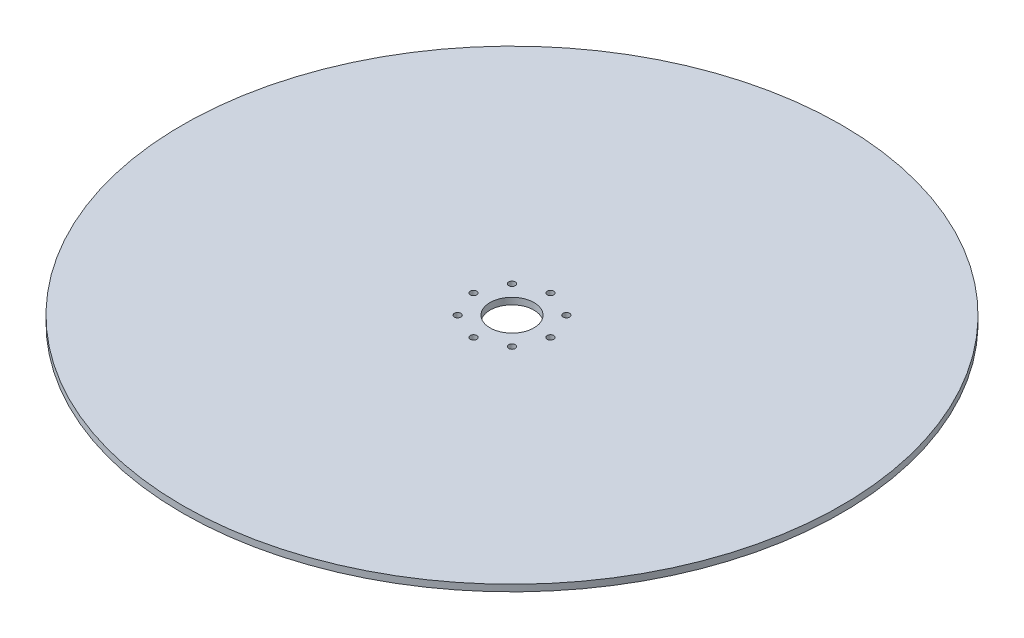
ISO-10303-21;
HEADER;
FILE_DESCRIPTION(('STEP AP214'),'2;1');
FILE_NAME('part.step','',(''),(''),'','','');
FILE_SCHEMA(('AUTOMOTIVE_DESIGN { 1 0 10303 214 1 1 1 1 }'));
ENDSEC;
DATA;
#1=APPLICATION_CONTEXT('core data for automotive mechanical design processes');
#2=APPLICATION_PROTOCOL_DEFINITION('international standard','automotive_design',2000,#1);
#3=PRODUCT_CONTEXT('',#1,'mechanical');
#4=PRODUCT('Part','Part','',(#3));
#5=PRODUCT_RELATED_PRODUCT_CATEGORY('part','',(#4));
#6=PRODUCT_DEFINITION_FORMATION('','',#4);
#7=PRODUCT_DEFINITION_CONTEXT('part definition',#1,'design');
#8=PRODUCT_DEFINITION('design','',#6,#7);
#9=PRODUCT_DEFINITION_SHAPE('','',#8);
#10=(LENGTH_UNIT() NAMED_UNIT(*) SI_UNIT(.MILLI.,.METRE.));
#11=(NAMED_UNIT(*) PLANE_ANGLE_UNIT() SI_UNIT($,.RADIAN.));
#12=(NAMED_UNIT(*) SI_UNIT($,.STERADIAN.) SOLID_ANGLE_UNIT());
#13=UNCERTAINTY_MEASURE_WITH_UNIT(LENGTH_MEASURE(1.E-05),#10,'distance_accuracy_value','');
#14=(GEOMETRIC_REPRESENTATION_CONTEXT(3) GLOBAL_UNCERTAINTY_ASSIGNED_CONTEXT((#13)) GLOBAL_UNIT_ASSIGNED_CONTEXT((#10,
#11,#12)) REPRESENTATION_CONTEXT('',''));
#15=CARTESIAN_POINT('',(0.,0.,0.));
#16=DIRECTION('',(0.,0.,1.));
#17=DIRECTION('',(1.,0.,0.));
#18=AXIS2_PLACEMENT_3D('',#15,#16,#17);
#19=CARTESIAN_POINT('',(0.,3.,0.));
#20=DIRECTION('',(0.,1.,0.));
#21=DIRECTION('',(0.,0.,1.));
#22=AXIS2_PLACEMENT_3D('',#19,#20,#21);
#23=PLANE('',#22);
#24=CARTESIAN_POINT('',(-12.3743686707646,3.,12.3743686707646));
#25=DIRECTION('',(0.,1.,0.));
#26=DIRECTION('',(0.,0.,1.));
#27=AXIS2_PLACEMENT_3D('',#24,#25,#26);
#28=CIRCLE('',#27,1.5);
#29=CARTESIAN_POINT('',(-12.3743686707646,3.,13.8743686707646));
#30=VERTEX_POINT('',#29);
#31=EDGE_CURVE('E90',#30,#30,#28,.T.);
#32=ORIENTED_EDGE('',*,*,#31,.F.);
#33=EDGE_LOOP('',(#32));
#34=FACE_BOUND('',#33,.T.);
#35=CARTESIAN_POINT('',(12.3743686707646,3.,12.3743686707646));
#36=DIRECTION('',(0.,1.,0.));
#37=DIRECTION('',(0.,0.,-1.));
#38=AXIS2_PLACEMENT_3D('',#35,#36,#37);
#39=CIRCLE('',#38,1.5);
#40=CARTESIAN_POINT('',(12.3743686707646,3.,10.8743686707646));
#41=VERTEX_POINT('',#40);
#42=EDGE_CURVE('E78',#41,#41,#39,.T.);
#43=ORIENTED_EDGE('',*,*,#42,.F.);
#44=EDGE_LOOP('',(#43));
#45=FACE_BOUND('',#44,.T.);
#46=CARTESIAN_POINT('',(0.,3.,-17.5));
#47=DIRECTION('',(0.,1.,0.));
#48=DIRECTION('',(0.,0.,1.));
#49=AXIS2_PLACEMENT_3D('',#46,#47,#48);
#50=CIRCLE('',#49,1.5);
#51=CARTESIAN_POINT('',(0.,3.,-16.));
#52=VERTEX_POINT('',#51);
#53=EDGE_CURVE('E66',#52,#52,#50,.T.);
#54=ORIENTED_EDGE('',*,*,#53,.F.);
#55=EDGE_LOOP('',(#54));
#56=FACE_BOUND('',#55,.T.);
#57=CARTESIAN_POINT('',(12.3743686707646,3.,-12.3743686707646));
#58=DIRECTION('',(0.,1.,0.));
#59=DIRECTION('',(0.,0.,1.));
#60=AXIS2_PLACEMENT_3D('',#57,#58,#59);
#61=CIRCLE('',#60,1.5);
#62=CARTESIAN_POINT('',(12.3743686707646,3.,-10.8743686707646));
#63=VERTEX_POINT('',#62);
#64=EDGE_CURVE('E54',#63,#63,#61,.T.);
#65=ORIENTED_EDGE('',*,*,#64,.F.);
#66=EDGE_LOOP('',(#65));
#67=FACE_BOUND('',#66,.T.);
#68=CARTESIAN_POINT('',(0.,3.,0.));
#69=DIRECTION('',(0.,1.,0.));
#70=DIRECTION('',(0.,0.,1.));
#71=AXIS2_PLACEMENT_3D('',#68,#69,#70);
#72=CIRCLE('',#71,150.);
#73=CARTESIAN_POINT('',(0.,3.,150.));
#74=VERTEX_POINT('',#73);
#75=EDGE_CURVE('E10',#74,#74,#72,.T.);
#76=ORIENTED_EDGE('',*,*,#75,.T.);
#77=EDGE_LOOP('',(#76));
#78=FACE_BOUND('',#77,.T.);
#79=CARTESIAN_POINT('',(0.,3.,0.));
#80=DIRECTION('',(0.,1.,0.));
#81=DIRECTION('',(0.,0.,1.));
#82=AXIS2_PLACEMENT_3D('',#79,#80,#81);
#83=CIRCLE('',#82,10.);
#84=CARTESIAN_POINT('',(0.,3.,10.));
#85=VERTEX_POINT('',#84);
#86=EDGE_CURVE('E49',#85,#85,#83,.T.);
#87=ORIENTED_EDGE('',*,*,#86,.F.);
#88=EDGE_LOOP('',(#87));
#89=FACE_BOUND('',#88,.T.);
#90=CARTESIAN_POINT('',(-12.3743686707646,3.,-12.3743686707646));
#91=DIRECTION('',(0.,1.,0.));
#92=DIRECTION('',(0.,0.,-1.));
#93=AXIS2_PLACEMENT_3D('',#90,#91,#92);
#94=CIRCLE('',#93,1.5);
#95=CARTESIAN_POINT('',(-12.3743686707646,3.,-13.8743686707646));
#96=VERTEX_POINT('',#95);
#97=EDGE_CURVE('E60',#96,#96,#94,.T.);
#98=ORIENTED_EDGE('',*,*,#97,.F.);
#99=EDGE_LOOP('',(#98));
#100=FACE_BOUND('',#99,.T.);
#101=CARTESIAN_POINT('',(17.5,3.,0.));
#102=DIRECTION('',(0.,1.,0.));
#103=DIRECTION('',(0.,0.,1.));
#104=AXIS2_PLACEMENT_3D('',#101,#102,#103);
#105=CIRCLE('',#104,1.5);
#106=CARTESIAN_POINT('',(17.5,3.,1.5));
#107=VERTEX_POINT('',#106);
#108=EDGE_CURVE('E72',#107,#107,#105,.T.);
#109=ORIENTED_EDGE('',*,*,#108,.F.);
#110=EDGE_LOOP('',(#109));
#111=FACE_BOUND('',#110,.T.);
#112=CARTESIAN_POINT('',(0.,3.,17.5));
#113=DIRECTION('',(0.,1.,0.));
#114=DIRECTION('',(0.,0.,-1.));
#115=AXIS2_PLACEMENT_3D('',#112,#113,#114);
#116=CIRCLE('',#115,1.5);
#117=CARTESIAN_POINT('',(0.,3.,16.));
#118=VERTEX_POINT('',#117);
#119=EDGE_CURVE('E84',#118,#118,#116,.T.);
#120=ORIENTED_EDGE('',*,*,#119,.F.);
#121=EDGE_LOOP('',(#120));
#122=FACE_BOUND('',#121,.T.);
#123=CARTESIAN_POINT('',(-17.5,3.,0.));
#124=DIRECTION('',(0.,1.,0.));
#125=DIRECTION('',(0.,0.,-1.));
#126=AXIS2_PLACEMENT_3D('',#123,#124,#125);
#127=CIRCLE('',#126,1.5);
#128=CARTESIAN_POINT('',(-17.5,3.,-1.5));
#129=VERTEX_POINT('',#128);
#130=EDGE_CURVE('E96',#129,#129,#127,.T.);
#131=ORIENTED_EDGE('',*,*,#130,.F.);
#132=EDGE_LOOP('',(#131));
#133=FACE_BOUND('',#132,.T.);
#134=ADVANCED_FACE('F38',(#34,#45,#56,#67,#78,#89,#100,#111,#122,#133),#23,.T.);
#135=CARTESIAN_POINT('',(0.,0.,0.));
#136=DIRECTION('',(0.,1.,0.));
#137=DIRECTION('',(0.,0.,1.));
#138=AXIS2_PLACEMENT_3D('',#135,#136,#137);
#139=PLANE('',#138);
#140=CARTESIAN_POINT('',(0.,0.,0.));
#141=DIRECTION('',(0.,1.,0.));
#142=DIRECTION('',(0.,0.,1.));
#143=AXIS2_PLACEMENT_3D('',#140,#141,#142);
#144=CIRCLE('',#143,150.);
#145=CARTESIAN_POINT('',(0.,0.,150.));
#146=VERTEX_POINT('',#145);
#147=EDGE_CURVE('E42',#146,#146,#144,.T.);
#148=ORIENTED_EDGE('',*,*,#147,.F.);
#149=EDGE_LOOP('',(#148));
#150=FACE_BOUND('',#149,.T.);
#151=CARTESIAN_POINT('',(0.,0.,0.));
#152=DIRECTION('',(0.,1.,0.));
#153=DIRECTION('',(0.,0.,1.));
#154=AXIS2_PLACEMENT_3D('',#151,#152,#153);
#155=CIRCLE('',#154,10.);
#156=CARTESIAN_POINT('',(0.,0.,10.));
#157=VERTEX_POINT('',#156);
#158=EDGE_CURVE('E51',#157,#157,#155,.T.);
#159=ORIENTED_EDGE('',*,*,#158,.T.);
#160=EDGE_LOOP('',(#159));
#161=FACE_BOUND('',#160,.T.);
#162=CARTESIAN_POINT('',(12.3743686707646,0.,-12.3743686707646));
#163=DIRECTION('',(0.,1.,0.));
#164=DIRECTION('',(0.,0.,1.));
#165=AXIS2_PLACEMENT_3D('',#162,#163,#164);
#166=CIRCLE('',#165,1.5);
#167=CARTESIAN_POINT('',(12.3743686707646,0.,-10.8743686707646));
#168=VERTEX_POINT('',#167);
#169=EDGE_CURVE('E57',#168,#168,#166,.T.);
#170=ORIENTED_EDGE('',*,*,#169,.T.);
#171=EDGE_LOOP('',(#170));
#172=FACE_BOUND('',#171,.T.);
#173=CARTESIAN_POINT('',(-12.3743686707646,0.,-12.3743686707646));
#174=DIRECTION('',(0.,1.,0.));
#175=DIRECTION('',(0.,0.,-1.));
#176=AXIS2_PLACEMENT_3D('',#173,#174,#175);
#177=CIRCLE('',#176,1.5);
#178=CARTESIAN_POINT('',(-12.3743686707646,0.,-13.8743686707646));
#179=VERTEX_POINT('',#178);
#180=EDGE_CURVE('E63',#179,#179,#177,.T.);
#181=ORIENTED_EDGE('',*,*,#180,.T.);
#182=EDGE_LOOP('',(#181));
#183=FACE_BOUND('',#182,.T.);
#184=CARTESIAN_POINT('',(0.,0.,-17.5));
#185=DIRECTION('',(0.,1.,0.));
#186=DIRECTION('',(0.,0.,1.));
#187=AXIS2_PLACEMENT_3D('',#184,#185,#186);
#188=CIRCLE('',#187,1.5);
#189=CARTESIAN_POINT('',(0.,0.,-16.));
#190=VERTEX_POINT('',#189);
#191=EDGE_CURVE('E69',#190,#190,#188,.T.);
#192=ORIENTED_EDGE('',*,*,#191,.T.);
#193=EDGE_LOOP('',(#192));
#194=FACE_BOUND('',#193,.T.);
#195=CARTESIAN_POINT('',(17.5,0.,0.));
#196=DIRECTION('',(0.,1.,0.));
#197=DIRECTION('',(0.,0.,1.));
#198=AXIS2_PLACEMENT_3D('',#195,#196,#197);
#199=CIRCLE('',#198,1.5);
#200=CARTESIAN_POINT('',(17.5,0.,1.5));
#201=VERTEX_POINT('',#200);
#202=EDGE_CURVE('E75',#201,#201,#199,.T.);
#203=ORIENTED_EDGE('',*,*,#202,.T.);
#204=EDGE_LOOP('',(#203));
#205=FACE_BOUND('',#204,.T.);
#206=CARTESIAN_POINT('',(12.3743686707646,0.,12.3743686707646));
#207=DIRECTION('',(0.,1.,0.));
#208=DIRECTION('',(0.,0.,-1.));
#209=AXIS2_PLACEMENT_3D('',#206,#207,#208);
#210=CIRCLE('',#209,1.5);
#211=CARTESIAN_POINT('',(12.3743686707646,0.,10.8743686707646));
#212=VERTEX_POINT('',#211);
#213=EDGE_CURVE('E81',#212,#212,#210,.T.);
#214=ORIENTED_EDGE('',*,*,#213,.T.);
#215=EDGE_LOOP('',(#214));
#216=FACE_BOUND('',#215,.T.);
#217=CARTESIAN_POINT('',(0.,0.,17.5));
#218=DIRECTION('',(0.,1.,0.));
#219=DIRECTION('',(0.,0.,-1.));
#220=AXIS2_PLACEMENT_3D('',#217,#218,#219);
#221=CIRCLE('',#220,1.5);
#222=CARTESIAN_POINT('',(0.,0.,16.));
#223=VERTEX_POINT('',#222);
#224=EDGE_CURVE('E87',#223,#223,#221,.T.);
#225=ORIENTED_EDGE('',*,*,#224,.T.);
#226=EDGE_LOOP('',(#225));
#227=FACE_BOUND('',#226,.T.);
#228=CARTESIAN_POINT('',(-12.3743686707646,0.,12.3743686707646));
#229=DIRECTION('',(0.,1.,0.));
#230=DIRECTION('',(0.,0.,1.));
#231=AXIS2_PLACEMENT_3D('',#228,#229,#230);
#232=CIRCLE('',#231,1.5);
#233=CARTESIAN_POINT('',(-12.3743686707646,0.,13.8743686707646));
#234=VERTEX_POINT('',#233);
#235=EDGE_CURVE('E93',#234,#234,#232,.T.);
#236=ORIENTED_EDGE('',*,*,#235,.T.);
#237=EDGE_LOOP('',(#236));
#238=FACE_BOUND('',#237,.T.);
#239=CARTESIAN_POINT('',(-17.5,0.,0.));
#240=DIRECTION('',(0.,1.,0.));
#241=DIRECTION('',(0.,0.,-1.));
#242=AXIS2_PLACEMENT_3D('',#239,#240,#241);
#243=CIRCLE('',#242,1.5);
#244=CARTESIAN_POINT('',(-17.5,0.,-1.5));
#245=VERTEX_POINT('',#244);
#246=EDGE_CURVE('E99',#245,#245,#243,.T.);
#247=ORIENTED_EDGE('',*,*,#246,.T.);
#248=EDGE_LOOP('',(#247));
#249=FACE_BOUND('',#248,.T.);
#250=ADVANCED_FACE('F109',(#150,#161,#172,#183,#194,#205,#216,#227,#238,#249),#139,.F.);
#251=CARTESIAN_POINT('',(0.,3.,0.));
#252=DIRECTION('',(0.,-1.,0.));
#253=DIRECTION('',(0.,0.,-1.));
#254=AXIS2_PLACEMENT_3D('',#251,#252,#253);
#255=CYLINDRICAL_SURFACE('',#254,150.);
#256=ORIENTED_EDGE('',*,*,#75,.F.);
#257=EDGE_LOOP('',(#256));
#258=FACE_BOUND('',#257,.T.);
#259=ORIENTED_EDGE('',*,*,#147,.T.);
#260=EDGE_LOOP('',(#259));
#261=FACE_BOUND('',#260,.T.);
#262=ADVANCED_FACE('F40',(#258,#261),#255,.T.);
#263=CARTESIAN_POINT('',(0.,3.,0.));
#264=DIRECTION('',(0.,-1.,0.));
#265=DIRECTION('',(0.,0.,-1.));
#266=AXIS2_PLACEMENT_3D('',#263,#264,#265);
#267=CYLINDRICAL_SURFACE('',#266,10.);
#268=ORIENTED_EDGE('',*,*,#86,.T.);
#269=EDGE_LOOP('',(#268));
#270=FACE_BOUND('',#269,.T.);
#271=ORIENTED_EDGE('',*,*,#158,.F.);
#272=EDGE_LOOP('',(#271));
#273=FACE_BOUND('',#272,.T.);
#274=ADVANCED_FACE('F119',(#270,#273),#267,.F.);
#275=CARTESIAN_POINT('',(12.3743686707646,3.,-12.3743686707646));
#276=DIRECTION('',(0.,-1.,0.));
#277=DIRECTION('',(0.,0.,-1.));
#278=AXIS2_PLACEMENT_3D('',#275,#276,#277);
#279=CYLINDRICAL_SURFACE('',#278,1.5);
#280=ORIENTED_EDGE('',*,*,#64,.T.);
#281=EDGE_LOOP('',(#280));
#282=FACE_BOUND('',#281,.T.);
#283=ORIENTED_EDGE('',*,*,#169,.F.);
#284=EDGE_LOOP('',(#283));
#285=FACE_BOUND('',#284,.T.);
#286=ADVANCED_FACE('F122',(#282,#285),#279,.F.);
#287=CARTESIAN_POINT('',(-12.3743686707646,3.,-12.3743686707646));
#288=DIRECTION('',(0.,-1.,0.));
#289=DIRECTION('',(0.,0.,-1.));
#290=AXIS2_PLACEMENT_3D('',#287,#288,#289);
#291=CYLINDRICAL_SURFACE('',#290,1.5);
#292=ORIENTED_EDGE('',*,*,#97,.T.);
#293=EDGE_LOOP('',(#292));
#294=FACE_BOUND('',#293,.T.);
#295=ORIENTED_EDGE('',*,*,#180,.F.);
#296=EDGE_LOOP('',(#295));
#297=FACE_BOUND('',#296,.T.);
#298=ADVANCED_FACE('F126',(#294,#297),#291,.F.);
#299=CARTESIAN_POINT('',(0.,3.,-17.5));
#300=DIRECTION('',(0.,-1.,0.));
#301=DIRECTION('',(0.,0.,-1.));
#302=AXIS2_PLACEMENT_3D('',#299,#300,#301);
#303=CYLINDRICAL_SURFACE('',#302,1.5);
#304=ORIENTED_EDGE('',*,*,#53,.T.);
#305=EDGE_LOOP('',(#304));
#306=FACE_BOUND('',#305,.T.);
#307=ORIENTED_EDGE('',*,*,#191,.F.);
#308=EDGE_LOOP('',(#307));
#309=FACE_BOUND('',#308,.T.);
#310=ADVANCED_FACE('F130',(#306,#309),#303,.F.);
#311=CARTESIAN_POINT('',(17.5,3.,0.));
#312=DIRECTION('',(0.,-1.,0.));
#313=DIRECTION('',(0.,0.,-1.));
#314=AXIS2_PLACEMENT_3D('',#311,#312,#313);
#315=CYLINDRICAL_SURFACE('',#314,1.5);
#316=ORIENTED_EDGE('',*,*,#108,.T.);
#317=EDGE_LOOP('',(#316));
#318=FACE_BOUND('',#317,.T.);
#319=ORIENTED_EDGE('',*,*,#202,.F.);
#320=EDGE_LOOP('',(#319));
#321=FACE_BOUND('',#320,.T.);
#322=ADVANCED_FACE('F134',(#318,#321),#315,.F.);
#323=CARTESIAN_POINT('',(12.3743686707646,3.,12.3743686707646));
#324=DIRECTION('',(0.,-1.,0.));
#325=DIRECTION('',(0.,0.,-1.));
#326=AXIS2_PLACEMENT_3D('',#323,#324,#325);
#327=CYLINDRICAL_SURFACE('',#326,1.5);
#328=ORIENTED_EDGE('',*,*,#42,.T.);
#329=EDGE_LOOP('',(#328));
#330=FACE_BOUND('',#329,.T.);
#331=ORIENTED_EDGE('',*,*,#213,.F.);
#332=EDGE_LOOP('',(#331));
#333=FACE_BOUND('',#332,.T.);
#334=ADVANCED_FACE('F138',(#330,#333),#327,.F.);
#335=CARTESIAN_POINT('',(0.,3.,17.5));
#336=DIRECTION('',(0.,-1.,0.));
#337=DIRECTION('',(0.,0.,-1.));
#338=AXIS2_PLACEMENT_3D('',#335,#336,#337);
#339=CYLINDRICAL_SURFACE('',#338,1.5);
#340=ORIENTED_EDGE('',*,*,#119,.T.);
#341=EDGE_LOOP('',(#340));
#342=FACE_BOUND('',#341,.T.);
#343=ORIENTED_EDGE('',*,*,#224,.F.);
#344=EDGE_LOOP('',(#343));
#345=FACE_BOUND('',#344,.T.);
#346=ADVANCED_FACE('F142',(#342,#345),#339,.F.);
#347=CARTESIAN_POINT('',(-12.3743686707646,3.,12.3743686707646));
#348=DIRECTION('',(0.,-1.,0.));
#349=DIRECTION('',(0.,0.,-1.));
#350=AXIS2_PLACEMENT_3D('',#347,#348,#349);
#351=CYLINDRICAL_SURFACE('',#350,1.5);
#352=ORIENTED_EDGE('',*,*,#31,.T.);
#353=EDGE_LOOP('',(#352));
#354=FACE_BOUND('',#353,.T.);
#355=ORIENTED_EDGE('',*,*,#235,.F.);
#356=EDGE_LOOP('',(#355));
#357=FACE_BOUND('',#356,.T.);
#358=ADVANCED_FACE('F146',(#354,#357),#351,.F.);
#359=CARTESIAN_POINT('',(-17.5,3.,0.));
#360=DIRECTION('',(0.,-1.,0.));
#361=DIRECTION('',(0.,0.,-1.));
#362=AXIS2_PLACEMENT_3D('',#359,#360,#361);
#363=CYLINDRICAL_SURFACE('',#362,1.5);
#364=ORIENTED_EDGE('',*,*,#130,.T.);
#365=EDGE_LOOP('',(#364));
#366=FACE_BOUND('',#365,.T.);
#367=ORIENTED_EDGE('',*,*,#246,.F.);
#368=EDGE_LOOP('',(#367));
#369=FACE_BOUND('',#368,.T.);
#370=ADVANCED_FACE('F105',(#366,#369),#363,.F.);
#371=CLOSED_SHELL('',(#134,#250,#262,#274,#286,#298,#310,#322,#334,#346,#358,#370));
#372=MANIFOLD_SOLID_BREP('B2',#371);
#373=ADVANCED_BREP_SHAPE_REPRESENTATION('',(#18,#372),#14);
#374=SHAPE_DEFINITION_REPRESENTATION(#9,#373);
ENDSEC;
END-ISO-10303-21;
